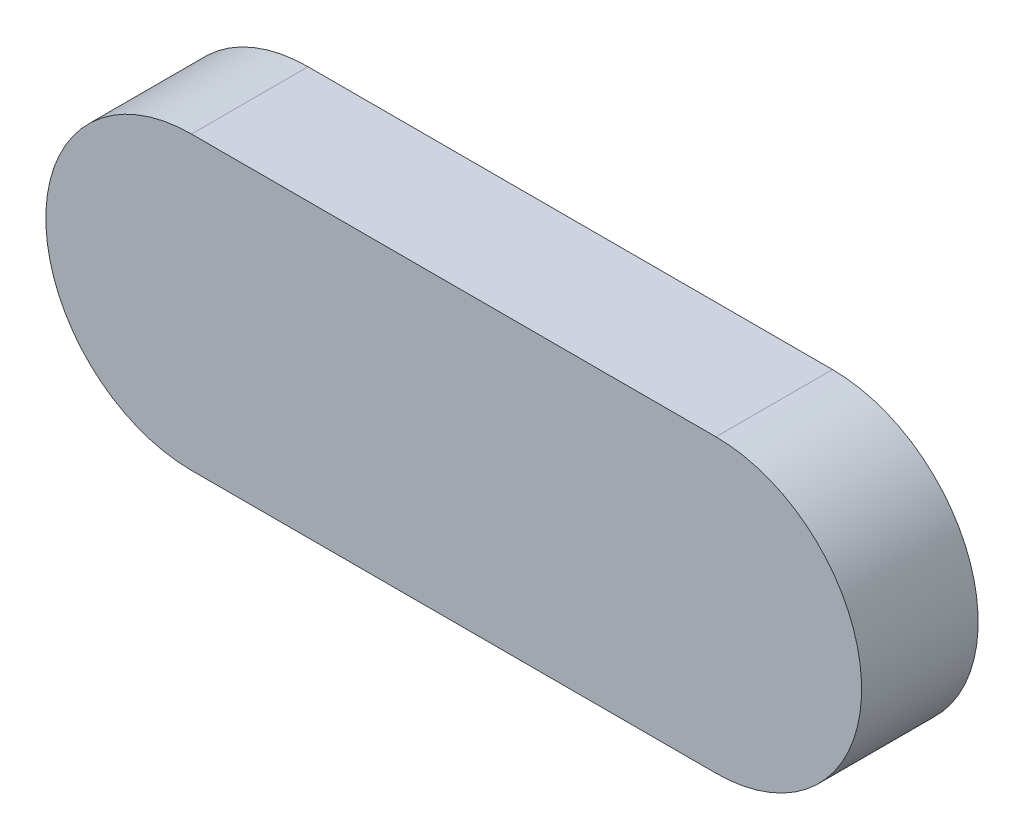
ISO-10303-21;
HEADER;
FILE_DESCRIPTION(('STEP AP214'),'2;1');
FILE_NAME('part.step','',(''),(''),'','','');
FILE_SCHEMA(('AUTOMOTIVE_DESIGN { 1 0 10303 214 1 1 1 1 }'));
ENDSEC;
DATA;
#1=APPLICATION_CONTEXT('core data for automotive mechanical design processes');
#2=APPLICATION_PROTOCOL_DEFINITION('international standard','automotive_design',2000,#1);
#3=PRODUCT_CONTEXT('',#1,'mechanical');
#4=PRODUCT('Part','Part','',(#3));
#5=PRODUCT_RELATED_PRODUCT_CATEGORY('part','',(#4));
#6=PRODUCT_DEFINITION_FORMATION('','',#4);
#7=PRODUCT_DEFINITION_CONTEXT('part definition',#1,'design');
#8=PRODUCT_DEFINITION('design','',#6,#7);
#9=PRODUCT_DEFINITION_SHAPE('','',#8);
#10=(LENGTH_UNIT() NAMED_UNIT(*) SI_UNIT(.MILLI.,.METRE.));
#11=(NAMED_UNIT(*) PLANE_ANGLE_UNIT() SI_UNIT($,.RADIAN.));
#12=(NAMED_UNIT(*) SI_UNIT($,.STERADIAN.) SOLID_ANGLE_UNIT());
#13=UNCERTAINTY_MEASURE_WITH_UNIT(LENGTH_MEASURE(1.E-05),#10,'distance_accuracy_value','');
#14=(GEOMETRIC_REPRESENTATION_CONTEXT(3) GLOBAL_UNCERTAINTY_ASSIGNED_CONTEXT((#13)) GLOBAL_UNIT_ASSIGNED_CONTEXT((#10,
#11,#12)) REPRESENTATION_CONTEXT('',''));
#15=CARTESIAN_POINT('',(0.,0.,0.));
#16=DIRECTION('',(0.,0.,1.));
#17=DIRECTION('',(1.,0.,0.));
#18=AXIS2_PLACEMENT_3D('',#15,#16,#17);
#19=CARTESIAN_POINT('',(0.,0.,8.));
#20=DIRECTION('',(0.,0.,-1.));
#21=DIRECTION('',(-1.,0.,0.));
#22=AXIS2_PLACEMENT_3D('',#19,#20,#21);
#23=CYLINDRICAL_SURFACE('',#22,10.);
#24=CARTESIAN_POINT('',(0.,0.,0.));
#25=DIRECTION('',(0.,0.,1.));
#26=DIRECTION('',(1.,0.,0.));
#27=AXIS2_PLACEMENT_3D('',#24,#25,#26);
#28=CIRCLE('',#27,10.);
#29=CARTESIAN_POINT('',(0.,10.,0.));
#30=VERTEX_POINT('',#29);
#31=CARTESIAN_POINT('',(0.,-10.,0.));
#32=VERTEX_POINT('',#31);
#33=EDGE_CURVE('E107',#30,#32,#28,.T.);
#34=ORIENTED_EDGE('',*,*,#33,.T.);
#35=DIRECTION('',(0.,0.,-1.));
#36=VECTOR('',#35,1.);
#37=CARTESIAN_POINT('',(0.,-10.,8.));
#38=LINE('',#37,#36);
#39=CARTESIAN_POINT('',(0.,-10.,8.));
#40=VERTEX_POINT('',#39);
#41=EDGE_CURVE('E11',#40,#32,#38,.T.);
#42=ORIENTED_EDGE('',*,*,#41,.F.);
#43=CARTESIAN_POINT('',(0.,0.,8.));
#44=DIRECTION('',(0.,0.,1.));
#45=DIRECTION('',(1.,0.,0.));
#46=AXIS2_PLACEMENT_3D('',#43,#44,#45);
#47=CIRCLE('',#46,10.);
#48=CARTESIAN_POINT('',(0.,10.,8.));
#49=VERTEX_POINT('',#48);
#50=EDGE_CURVE('E91',#49,#40,#47,.T.);
#51=ORIENTED_EDGE('',*,*,#50,.F.);
#52=DIRECTION('',(0.,0.,-1.));
#53=VECTOR('',#52,1.);
#54=CARTESIAN_POINT('',(0.,10.,8.));
#55=LINE('',#54,#53);
#56=EDGE_CURVE('E103',#49,#30,#55,.T.);
#57=ORIENTED_EDGE('',*,*,#56,.T.);
#58=EDGE_LOOP('',(#34,#42,#51,#57));
#59=FACE_BOUND('',#58,.T.);
#60=ADVANCED_FACE('F39',(#59),#23,.T.);
#61=CARTESIAN_POINT('',(0.,-10.,8.));
#62=DIRECTION('',(0.,1.,0.));
#63=DIRECTION('',(0.,0.,1.));
#64=AXIS2_PLACEMENT_3D('',#61,#62,#63);
#65=PLANE('',#64);
#66=DIRECTION('',(1.,0.,0.));
#67=VECTOR('',#66,1.);
#68=CARTESIAN_POINT('',(0.,-10.,0.));
#69=LINE('',#68,#67);
#70=CARTESIAN_POINT('',(36.,-10.,0.));
#71=VERTEX_POINT('',#70);
#72=EDGE_CURVE('E96',#32,#71,#69,.T.);
#73=ORIENTED_EDGE('',*,*,#72,.T.);
#74=DIRECTION('',(0.,0.,-1.));
#75=VECTOR('',#74,1.);
#76=CARTESIAN_POINT('',(36.,-10.,8.));
#77=LINE('',#76,#75);
#78=CARTESIAN_POINT('',(36.,-10.,8.));
#79=VERTEX_POINT('',#78);
#80=EDGE_CURVE('E48',#79,#71,#77,.T.);
#81=ORIENTED_EDGE('',*,*,#80,.F.);
#82=DIRECTION('',(1.,0.,0.));
#83=VECTOR('',#82,1.);
#84=CARTESIAN_POINT('',(0.,-10.,8.));
#85=LINE('',#84,#83);
#86=EDGE_CURVE('E86',#40,#79,#85,.T.);
#87=ORIENTED_EDGE('',*,*,#86,.F.);
#88=ORIENTED_EDGE('',*,*,#41,.T.);
#89=EDGE_LOOP('',(#73,#81,#87,#88));
#90=FACE_BOUND('',#89,.T.);
#91=ADVANCED_FACE('F95',(#90),#65,.F.);
#92=CARTESIAN_POINT('',(36.,0.,8.));
#93=DIRECTION('',(0.,0.,-1.));
#94=DIRECTION('',(-1.,0.,0.));
#95=AXIS2_PLACEMENT_3D('',#92,#93,#94);
#96=CYLINDRICAL_SURFACE('',#95,10.);
#97=CARTESIAN_POINT('',(36.,0.,0.));
#98=DIRECTION('',(0.,0.,1.));
#99=DIRECTION('',(1.,0.,0.));
#100=AXIS2_PLACEMENT_3D('',#97,#98,#99);
#101=CIRCLE('',#100,10.);
#102=CARTESIAN_POINT('',(36.,10.,0.));
#103=VERTEX_POINT('',#102);
#104=EDGE_CURVE('E73',#71,#103,#101,.T.);
#105=ORIENTED_EDGE('',*,*,#104,.T.);
#106=DIRECTION('',(0.,0.,-1.));
#107=VECTOR('',#106,1.);
#108=CARTESIAN_POINT('',(36.,10.,8.));
#109=LINE('',#108,#107);
#110=CARTESIAN_POINT('',(36.,10.,8.));
#111=VERTEX_POINT('',#110);
#112=EDGE_CURVE('E98',#111,#103,#109,.T.);
#113=ORIENTED_EDGE('',*,*,#112,.F.);
#114=CARTESIAN_POINT('',(36.,0.,8.));
#115=DIRECTION('',(0.,0.,1.));
#116=DIRECTION('',(1.,0.,0.));
#117=AXIS2_PLACEMENT_3D('',#114,#115,#116);
#118=CIRCLE('',#117,10.);
#119=EDGE_CURVE('E89',#79,#111,#118,.T.);
#120=ORIENTED_EDGE('',*,*,#119,.F.);
#121=ORIENTED_EDGE('',*,*,#80,.T.);
#122=EDGE_LOOP('',(#105,#113,#120,#121));
#123=FACE_BOUND('',#122,.T.);
#124=ADVANCED_FACE('F99',(#123),#96,.T.);
#125=CARTESIAN_POINT('',(0.,10.,8.));
#126=DIRECTION('',(0.,-1.,0.));
#127=DIRECTION('',(0.,0.,-1.));
#128=AXIS2_PLACEMENT_3D('',#125,#126,#127);
#129=PLANE('',#128);
#130=DIRECTION('',(-1.,0.,0.));
#131=VECTOR('',#130,1.);
#132=CARTESIAN_POINT('',(0.,10.,0.));
#133=LINE('',#132,#131);
#134=EDGE_CURVE('E79',#103,#30,#133,.T.);
#135=ORIENTED_EDGE('',*,*,#134,.T.);
#136=ORIENTED_EDGE('',*,*,#56,.F.);
#137=DIRECTION('',(-1.,0.,0.));
#138=VECTOR('',#137,1.);
#139=CARTESIAN_POINT('',(0.,10.,8.));
#140=LINE('',#139,#138);
#141=EDGE_CURVE('E56',#111,#49,#140,.T.);
#142=ORIENTED_EDGE('',*,*,#141,.F.);
#143=ORIENTED_EDGE('',*,*,#112,.T.);
#144=EDGE_LOOP('',(#135,#136,#142,#143));
#145=FACE_BOUND('',#144,.T.);
#146=ADVANCED_FACE('F120',(#145),#129,.F.);
#147=CARTESIAN_POINT('',(0.,0.,8.));
#148=DIRECTION('',(0.,0.,1.));
#149=DIRECTION('',(1.,0.,0.));
#150=AXIS2_PLACEMENT_3D('',#147,#148,#149);
#151=PLANE('',#150);
#152=ORIENTED_EDGE('',*,*,#50,.T.);
#153=ORIENTED_EDGE('',*,*,#86,.T.);
#154=ORIENTED_EDGE('',*,*,#119,.T.);
#155=ORIENTED_EDGE('',*,*,#141,.T.);
#156=EDGE_LOOP('',(#152,#153,#154,#155));
#157=FACE_BOUND('',#156,.T.);
#158=ADVANCED_FACE('F87',(#157),#151,.T.);
#159=CARTESIAN_POINT('',(0.,0.,0.));
#160=DIRECTION('',(0.,0.,1.));
#161=DIRECTION('',(1.,0.,0.));
#162=AXIS2_PLACEMENT_3D('',#159,#160,#161);
#163=PLANE('',#162);
#164=ORIENTED_EDGE('',*,*,#33,.F.);
#165=ORIENTED_EDGE('',*,*,#134,.F.);
#166=ORIENTED_EDGE('',*,*,#104,.F.);
#167=ORIENTED_EDGE('',*,*,#72,.F.);
#168=EDGE_LOOP('',(#164,#165,#166,#167));
#169=FACE_BOUND('',#168,.T.);
#170=ADVANCED_FACE('F123',(#169),#163,.F.);
#171=CLOSED_SHELL('',(#60,#91,#124,#146,#158,#170));
#172=MANIFOLD_SOLID_BREP('B2',#171);
#173=ADVANCED_BREP_SHAPE_REPRESENTATION('',(#18,#172),#14);
#174=SHAPE_DEFINITION_REPRESENTATION(#9,#173);
ENDSEC;
END-ISO-10303-21;
